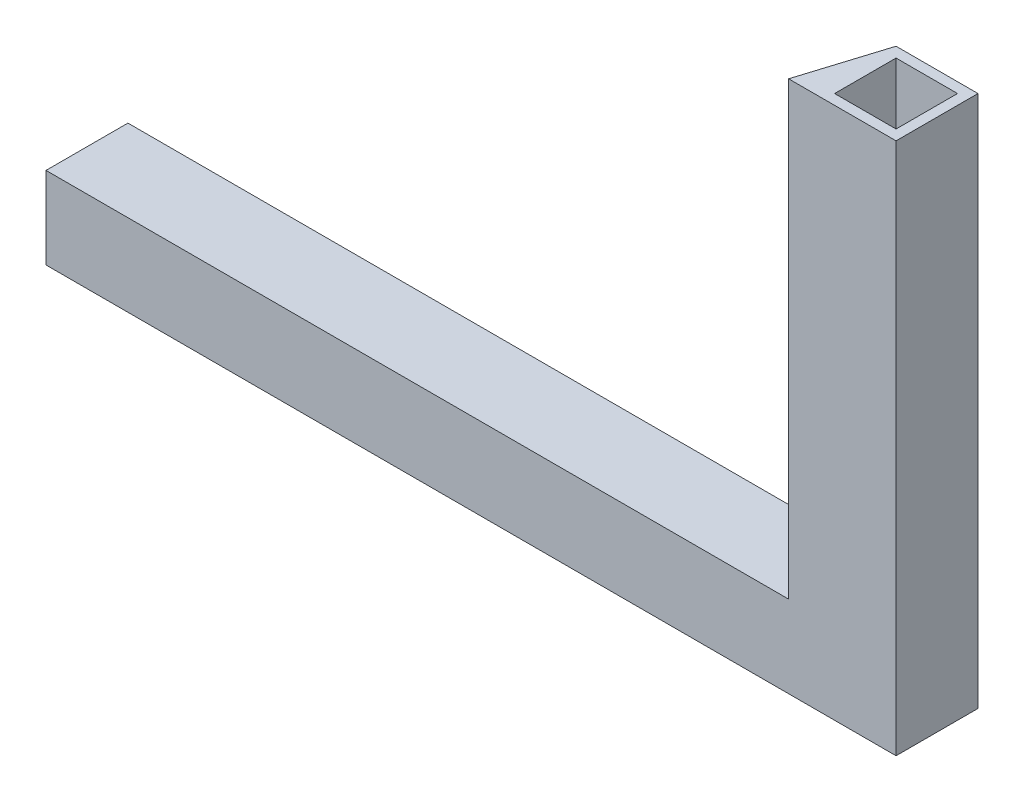
ISO-10303-21;
HEADER;
FILE_DESCRIPTION(('STEP AP214'),'2;1');
FILE_NAME('part.step','',(''),(''),'','','');
FILE_SCHEMA(('AUTOMOTIVE_DESIGN { 1 0 10303 214 1 1 1 1 }'));
ENDSEC;
DATA;
#1=APPLICATION_CONTEXT('core data for automotive mechanical design processes');
#2=APPLICATION_PROTOCOL_DEFINITION('international standard','automotive_design',2000,#1);
#3=PRODUCT_CONTEXT('',#1,'mechanical');
#4=PRODUCT('Part','Part','',(#3));
#5=PRODUCT_RELATED_PRODUCT_CATEGORY('part','',(#4));
#6=PRODUCT_DEFINITION_FORMATION('','',#4);
#7=PRODUCT_DEFINITION_CONTEXT('part definition',#1,'design');
#8=PRODUCT_DEFINITION('design','',#6,#7);
#9=PRODUCT_DEFINITION_SHAPE('','',#8);
#10=(LENGTH_UNIT() NAMED_UNIT(*) SI_UNIT(.MILLI.,.METRE.));
#11=(NAMED_UNIT(*) PLANE_ANGLE_UNIT() SI_UNIT($,.RADIAN.));
#12=(NAMED_UNIT(*) SI_UNIT($,.STERADIAN.) SOLID_ANGLE_UNIT());
#13=UNCERTAINTY_MEASURE_WITH_UNIT(LENGTH_MEASURE(1.E-05),#10,'distance_accuracy_value','');
#14=(GEOMETRIC_REPRESENTATION_CONTEXT(3) GLOBAL_UNCERTAINTY_ASSIGNED_CONTEXT((#13)) GLOBAL_UNIT_ASSIGNED_CONTEXT((#10,
#11,#12)) REPRESENTATION_CONTEXT('',''));
#15=CARTESIAN_POINT('',(0.,0.,0.));
#16=DIRECTION('',(0.,0.,1.));
#17=DIRECTION('',(1.,0.,0.));
#18=AXIS2_PLACEMENT_3D('',#15,#16,#17);
#19=CARTESIAN_POINT('',(0.,20.,-20.));
#20=DIRECTION('',(1.,0.,0.));
#21=DIRECTION('',(0.,0.,-1.));
#22=AXIS2_PLACEMENT_3D('',#19,#20,#21);
#23=PLANE('',#22);
#24=DIRECTION('',(0.,0.,-1.));
#25=VECTOR('',#24,1.);
#26=CARTESIAN_POINT('',(0.,15.,-15.));
#27=LINE('',#26,#25);
#28=CARTESIAN_POINT('',(0.,15.,-4.99999999999996));
#29=VERTEX_POINT('',#28);
#30=CARTESIAN_POINT('',(0.,15.,-15.));
#31=VERTEX_POINT('',#30);
#32=EDGE_CURVE('E190',#29,#31,#27,.T.);
#33=ORIENTED_EDGE('',*,*,#32,.F.);
#34=DIRECTION('',(0.,1.,0.));
#35=VECTOR('',#34,1.);
#36=CARTESIAN_POINT('',(0.,15.,-5.));
#37=LINE('',#36,#35);
#38=CARTESIAN_POINT('',(0.,5.,-5.));
#39=VERTEX_POINT('',#38);
#40=EDGE_CURVE('E56',#39,#29,#37,.T.);
#41=ORIENTED_EDGE('',*,*,#40,.F.);
#42=DIRECTION('',(0.,0.,1.));
#43=VECTOR('',#42,1.);
#44=CARTESIAN_POINT('',(0.,5.,-15.));
#45=LINE('',#44,#43);
#46=CARTESIAN_POINT('',(0.,5.,-15.));
#47=VERTEX_POINT('',#46);
#48=EDGE_CURVE('E179',#47,#39,#45,.T.);
#49=ORIENTED_EDGE('',*,*,#48,.F.);
#50=DIRECTION('',(0.,-1.,0.));
#51=VECTOR('',#50,1.);
#52=CARTESIAN_POINT('',(0.,15.,-15.));
#53=LINE('',#52,#51);
#54=EDGE_CURVE('E193',#31,#47,#53,.T.);
#55=ORIENTED_EDGE('',*,*,#54,.F.);
#56=EDGE_LOOP('',(#33,#41,#49,#55));
#57=FACE_BOUND('',#56,.T.);
#58=DIRECTION('',(0.,0.,1.));
#59=VECTOR('',#58,1.);
#60=CARTESIAN_POINT('',(0.,0.,-20.));
#61=LINE('',#60,#59);
#62=CARTESIAN_POINT('',(0.,0.,-20.));
#63=VERTEX_POINT('',#62);
#64=CARTESIAN_POINT('',(0.,0.,0.));
#65=VERTEX_POINT('',#64);
#66=EDGE_CURVE('E224',#63,#65,#61,.T.);
#67=ORIENTED_EDGE('',*,*,#66,.T.);
#68=DIRECTION('',(0.,-1.,0.));
#69=VECTOR('',#68,1.);
#70=CARTESIAN_POINT('',(0.,20.,0.));
#71=LINE('',#70,#69);
#72=CARTESIAN_POINT('',(0.,20.,0.));
#73=VERTEX_POINT('',#72);
#74=EDGE_CURVE('E11',#73,#65,#71,.T.);
#75=ORIENTED_EDGE('',*,*,#74,.F.);
#76=DIRECTION('',(0.,0.,1.));
#77=VECTOR('',#76,1.);
#78=CARTESIAN_POINT('',(0.,20.,-20.));
#79=LINE('',#78,#77);
#80=CARTESIAN_POINT('',(0.,20.,-20.));
#81=VERTEX_POINT('',#80);
#82=EDGE_CURVE('E225',#81,#73,#79,.T.);
#83=ORIENTED_EDGE('',*,*,#82,.F.);
#84=DIRECTION('',(0.,-1.,0.));
#85=VECTOR('',#84,1.);
#86=CARTESIAN_POINT('',(0.,20.,-20.));
#87=LINE('',#86,#85);
#88=EDGE_CURVE('E233',#81,#63,#87,.T.);
#89=ORIENTED_EDGE('',*,*,#88,.T.);
#90=EDGE_LOOP('',(#67,#75,#83,#89));
#91=FACE_BOUND('',#90,.T.);
#92=ADVANCED_FACE('F33',(#57,#91),#23,.F.);
#93=CARTESIAN_POINT('',(0.,20.,0.));
#94=DIRECTION('',(0.,0.,-1.));
#95=DIRECTION('',(-1.,0.,0.));
#96=AXIS2_PLACEMENT_3D('',#93,#94,#95);
#97=PLANE('',#96);
#98=DIRECTION('',(1.,0.,0.));
#99=VECTOR('',#98,1.);
#100=CARTESIAN_POINT('',(0.,0.,0.));
#101=LINE('',#100,#99);
#102=CARTESIAN_POINT('',(207.5,0.,0.));
#103=VERTEX_POINT('',#102);
#104=EDGE_CURVE('E236',#65,#103,#101,.T.);
#105=ORIENTED_EDGE('',*,*,#104,.T.);
#106=DIRECTION('',(0.,-1.,0.));
#107=VECTOR('',#106,1.);
#108=CARTESIAN_POINT('',(207.5,20.,0.));
#109=LINE('',#108,#107);
#110=CARTESIAN_POINT('',(207.5,130.,0.));
#111=VERTEX_POINT('',#110);
#112=EDGE_CURVE('E41',#111,#103,#109,.T.);
#113=ORIENTED_EDGE('',*,*,#112,.F.);
#114=DIRECTION('',(1.,0.,0.));
#115=VECTOR('',#114,1.);
#116=CARTESIAN_POINT('',(181.270693680917,130.,0.));
#117=LINE('',#116,#115);
#118=CARTESIAN_POINT('',(181.270693680917,130.,0.));
#119=VERTEX_POINT('',#118);
#120=EDGE_CURVE('E213',#119,#111,#117,.T.);
#121=ORIENTED_EDGE('',*,*,#120,.F.);
#122=DIRECTION('',(0.,-1.,0.));
#123=VECTOR('',#122,1.);
#124=CARTESIAN_POINT('',(181.270693680917,130.,0.));
#125=LINE('',#124,#123);
#126=CARTESIAN_POINT('',(181.270693680917,20.,0.));
#127=VERTEX_POINT('',#126);
#128=EDGE_CURVE('E216',#119,#127,#125,.T.);
#129=ORIENTED_EDGE('',*,*,#128,.T.);
#130=DIRECTION('',(1.,0.,0.));
#131=VECTOR('',#130,1.);
#132=CARTESIAN_POINT('',(0.,20.,0.));
#133=LINE('',#132,#131);
#134=EDGE_CURVE('E228',#73,#127,#133,.T.);
#135=ORIENTED_EDGE('',*,*,#134,.F.);
#136=ORIENTED_EDGE('',*,*,#74,.T.);
#137=EDGE_LOOP('',(#105,#113,#121,#129,#135,#136));
#138=FACE_BOUND('',#137,.T.);
#139=ADVANCED_FACE('F274',(#138),#97,.F.);
#140=CARTESIAN_POINT('',(207.5,20.,0.));
#141=DIRECTION('',(-1.,0.,0.));
#142=DIRECTION('',(0.,0.,1.));
#143=AXIS2_PLACEMENT_3D('',#140,#141,#142);
#144=PLANE('',#143);
#145=DIRECTION('',(0.,0.,-1.));
#146=VECTOR('',#145,1.);
#147=CARTESIAN_POINT('',(207.5,0.,0.));
#148=LINE('',#147,#146);
#149=CARTESIAN_POINT('',(207.5,0.,-20.));
#150=VERTEX_POINT('',#149);
#151=EDGE_CURVE('E238',#103,#150,#148,.T.);
#152=ORIENTED_EDGE('',*,*,#151,.T.);
#153=DIRECTION('',(0.,-1.,0.));
#154=VECTOR('',#153,1.);
#155=CARTESIAN_POINT('',(207.5,20.,-20.));
#156=LINE('',#155,#154);
#157=CARTESIAN_POINT('',(207.5,130.,-20.));
#158=VERTEX_POINT('',#157);
#159=EDGE_CURVE('E243',#158,#150,#156,.T.);
#160=ORIENTED_EDGE('',*,*,#159,.F.);
#161=DIRECTION('',(0.,0.,-1.));
#162=VECTOR('',#161,1.);
#163=CARTESIAN_POINT('',(207.5,130.,0.));
#164=LINE('',#163,#162);
#165=EDGE_CURVE('E206',#111,#158,#164,.T.);
#166=ORIENTED_EDGE('',*,*,#165,.F.);
#167=ORIENTED_EDGE('',*,*,#112,.T.);
#168=EDGE_LOOP('',(#152,#160,#166,#167));
#169=FACE_BOUND('',#168,.T.);
#170=ADVANCED_FACE('F250',(#169),#144,.F.);
#171=CARTESIAN_POINT('',(207.5,20.,-20.));
#172=DIRECTION('',(0.,0.,1.));
#173=DIRECTION('',(1.,0.,0.));
#174=AXIS2_PLACEMENT_3D('',#171,#172,#173);
#175=PLANE('',#174);
#176=CARTESIAN_POINT('',(197.5,80.,-20.));
#177=DIRECTION('',(0.,0.,-1.));
#178=DIRECTION('',(-1.,0.,0.));
#179=AXIS2_PLACEMENT_3D('',#176,#177,#178);
#180=CIRCLE('',#179,1.59999999999999);
#181=CARTESIAN_POINT('',(195.9,80.,-20.));
#182=VERTEX_POINT('',#181);
#183=EDGE_CURVE('E172',#182,#182,#180,.T.);
#184=ORIENTED_EDGE('',*,*,#183,.F.);
#185=EDGE_LOOP('',(#184));
#186=FACE_BOUND('',#185,.T.);
#187=DIRECTION('',(-1.,0.,0.));
#188=VECTOR('',#187,1.);
#189=CARTESIAN_POINT('',(207.5,0.,-20.));
#190=LINE('',#189,#188);
#191=EDGE_CURVE('E229',#150,#63,#190,.T.);
#192=ORIENTED_EDGE('',*,*,#191,.T.);
#193=ORIENTED_EDGE('',*,*,#88,.F.);
#194=DIRECTION('',(-1.,0.,0.));
#195=VECTOR('',#194,1.);
#196=CARTESIAN_POINT('',(207.5,20.,-20.));
#197=LINE('',#196,#195);
#198=CARTESIAN_POINT('',(187.5,20.,-20.));
#199=VERTEX_POINT('',#198);
#200=EDGE_CURVE('E231',#199,#81,#197,.T.);
#201=ORIENTED_EDGE('',*,*,#200,.F.);
#202=DIRECTION('',(0.,-1.,0.));
#203=VECTOR('',#202,1.);
#204=CARTESIAN_POINT('',(187.5,130.,-20.));
#205=LINE('',#204,#203);
#206=CARTESIAN_POINT('',(187.5,130.,-20.));
#207=VERTEX_POINT('',#206);
#208=EDGE_CURVE('E221',#207,#199,#205,.T.);
#209=ORIENTED_EDGE('',*,*,#208,.F.);
#210=DIRECTION('',(-1.,0.,0.));
#211=VECTOR('',#210,1.);
#212=CARTESIAN_POINT('',(207.5,130.,-20.));
#213=LINE('',#212,#211);
#214=EDGE_CURVE('E209',#158,#207,#213,.T.);
#215=ORIENTED_EDGE('',*,*,#214,.F.);
#216=ORIENTED_EDGE('',*,*,#159,.T.);
#217=EDGE_LOOP('',(#192,#193,#201,#209,#215,#216));
#218=FACE_BOUND('',#217,.T.);
#219=ADVANCED_FACE('F259',(#186,#218),#175,.F.);
#220=CARTESIAN_POINT('',(0.,20.,0.));
#221=DIRECTION('',(0.,1.,0.));
#222=DIRECTION('',(0.,0.,1.));
#223=AXIS2_PLACEMENT_3D('',#220,#221,#222);
#224=PLANE('',#223);
#225=DIRECTION('',(-0.297374874077784,0.,0.954760799502798));
#226=VECTOR('',#225,1.);
#227=CARTESIAN_POINT('',(187.5,20.,-20.));
#228=LINE('',#227,#226);
#229=EDGE_CURVE('E200',#199,#127,#228,.T.);
#230=ORIENTED_EDGE('',*,*,#229,.F.);
#231=ORIENTED_EDGE('',*,*,#200,.T.);
#232=ORIENTED_EDGE('',*,*,#82,.T.);
#233=ORIENTED_EDGE('',*,*,#134,.T.);
#234=EDGE_LOOP('',(#230,#231,#232,#233));
#235=FACE_BOUND('',#234,.T.);
#236=ADVANCED_FACE('F266',(#235),#224,.T.);
#237=CARTESIAN_POINT('',(0.,0.,0.));
#238=DIRECTION('',(0.,1.,0.));
#239=DIRECTION('',(0.,0.,1.));
#240=AXIS2_PLACEMENT_3D('',#237,#238,#239);
#241=PLANE('',#240);
#242=ORIENTED_EDGE('',*,*,#66,.F.);
#243=ORIENTED_EDGE('',*,*,#191,.F.);
#244=ORIENTED_EDGE('',*,*,#151,.F.);
#245=ORIENTED_EDGE('',*,*,#104,.F.);
#246=EDGE_LOOP('',(#242,#243,#244,#245));
#247=FACE_BOUND('',#246,.T.);
#248=ADVANCED_FACE('F256',(#247),#241,.F.);
#249=CARTESIAN_POINT('',(187.5,130.,-20.));
#250=DIRECTION('',(0.954760799502798,0.,0.297374874077784));
#251=DIRECTION('',(0.297374874077784,0.,-0.954760799502798));
#252=AXIS2_PLACEMENT_3D('',#249,#250,#251);
#253=PLANE('',#252);
#254=ORIENTED_EDGE('',*,*,#229,.T.);
#255=ORIENTED_EDGE('',*,*,#128,.F.);
#256=DIRECTION('',(-0.297374874077784,0.,0.954760799502798));
#257=VECTOR('',#256,1.);
#258=CARTESIAN_POINT('',(187.5,130.,-20.));
#259=LINE('',#258,#257);
#260=EDGE_CURVE('E211',#207,#119,#259,.T.);
#261=ORIENTED_EDGE('',*,*,#260,.F.);
#262=ORIENTED_EDGE('',*,*,#208,.T.);
#263=EDGE_LOOP('',(#254,#255,#261,#262));
#264=FACE_BOUND('',#263,.T.);
#265=ADVANCED_FACE('F270',(#264),#253,.F.);
#266=CARTESIAN_POINT('',(0.,130.,0.));
#267=DIRECTION('',(0.,1.,0.));
#268=DIRECTION('',(0.,0.,1.));
#269=AXIS2_PLACEMENT_3D('',#266,#267,#268);
#270=PLANE('',#269);
#271=DIRECTION('',(0.,0.,1.));
#272=VECTOR('',#271,1.);
#273=CARTESIAN_POINT('',(190.,130.,-2.5));
#274=LINE('',#273,#272);
#275=CARTESIAN_POINT('',(190.,130.,-17.5));
#276=VERTEX_POINT('',#275);
#277=CARTESIAN_POINT('',(190.,130.,-2.5));
#278=VERTEX_POINT('',#277);
#279=EDGE_CURVE('E48',#276,#278,#274,.T.);
#280=ORIENTED_EDGE('',*,*,#279,.F.);
#281=DIRECTION('',(-1.,0.,0.));
#282=VECTOR('',#281,1.);
#283=CARTESIAN_POINT('',(205.,130.,-17.5));
#284=LINE('',#283,#282);
#285=CARTESIAN_POINT('',(205.,130.,-17.5));
#286=VERTEX_POINT('',#285);
#287=EDGE_CURVE('E154',#286,#276,#284,.T.);
#288=ORIENTED_EDGE('',*,*,#287,.F.);
#289=DIRECTION('',(0.,0.,-1.));
#290=VECTOR('',#289,1.);
#291=CARTESIAN_POINT('',(205.,130.,-2.5));
#292=LINE('',#291,#290);
#293=CARTESIAN_POINT('',(205.,130.,-2.5));
#294=VERTEX_POINT('',#293);
#295=EDGE_CURVE('E157',#294,#286,#292,.T.);
#296=ORIENTED_EDGE('',*,*,#295,.F.);
#297=DIRECTION('',(1.,0.,0.));
#298=VECTOR('',#297,1.);
#299=CARTESIAN_POINT('',(205.,130.,-2.5));
#300=LINE('',#299,#298);
#301=EDGE_CURVE('E163',#278,#294,#300,.T.);
#302=ORIENTED_EDGE('',*,*,#301,.F.);
#303=EDGE_LOOP('',(#280,#288,#296,#302));
#304=FACE_BOUND('',#303,.T.);
#305=ORIENTED_EDGE('',*,*,#165,.T.);
#306=ORIENTED_EDGE('',*,*,#214,.T.);
#307=ORIENTED_EDGE('',*,*,#260,.T.);
#308=ORIENTED_EDGE('',*,*,#120,.T.);
#309=EDGE_LOOP('',(#305,#306,#307,#308));
#310=FACE_BOUND('',#309,.T.);
#311=ADVANCED_FACE('F273',(#304,#310),#270,.T.);
#312=CARTESIAN_POINT('',(30.,15.,-4.99999999999996));
#313=DIRECTION('',(0.,0.,1.));
#314=DIRECTION('',(1.,0.,0.));
#315=AXIS2_PLACEMENT_3D('',#312,#313,#314);
#316=PLANE('',#315);
#317=ORIENTED_EDGE('',*,*,#40,.T.);
#318=DIRECTION('',(-1.,0.,0.));
#319=VECTOR('',#318,1.);
#320=CARTESIAN_POINT('',(30.,15.,-4.99999999999996));
#321=LINE('',#320,#319);
#322=CARTESIAN_POINT('',(30.,15.,-4.99999999999996));
#323=VERTEX_POINT('',#322);
#324=EDGE_CURVE('E188',#323,#29,#321,.T.);
#325=ORIENTED_EDGE('',*,*,#324,.F.);
#326=DIRECTION('',(0.,1.,0.));
#327=VECTOR('',#326,1.);
#328=CARTESIAN_POINT('',(30.,15.,-4.99999999999996));
#329=LINE('',#328,#327);
#330=CARTESIAN_POINT('',(30.,5.,-4.99999999999996));
#331=VERTEX_POINT('',#330);
#332=EDGE_CURVE('E175',#331,#323,#329,.T.);
#333=ORIENTED_EDGE('',*,*,#332,.F.);
#334=DIRECTION('',(-1.,0.,0.));
#335=VECTOR('',#334,1.);
#336=CARTESIAN_POINT('',(30.,5.,-4.99999999999996));
#337=LINE('',#336,#335);
#338=EDGE_CURVE('E198',#331,#39,#337,.T.);
#339=ORIENTED_EDGE('',*,*,#338,.T.);
#340=EDGE_LOOP('',(#317,#325,#333,#339));
#341=FACE_BOUND('',#340,.T.);
#342=ADVANCED_FACE('F294',(#341),#316,.F.);
#343=CARTESIAN_POINT('',(30.,5.,-15.));
#344=DIRECTION('',(0.,-1.,0.));
#345=DIRECTION('',(0.,0.,-1.));
#346=AXIS2_PLACEMENT_3D('',#343,#344,#345);
#347=PLANE('',#346);
#348=ORIENTED_EDGE('',*,*,#48,.T.);
#349=ORIENTED_EDGE('',*,*,#338,.F.);
#350=DIRECTION('',(0.,0.,1.));
#351=VECTOR('',#350,1.);
#352=CARTESIAN_POINT('',(30.,5.,-15.));
#353=LINE('',#352,#351);
#354=CARTESIAN_POINT('',(30.,5.,-15.));
#355=VERTEX_POINT('',#354);
#356=EDGE_CURVE('E185',#355,#331,#353,.T.);
#357=ORIENTED_EDGE('',*,*,#356,.F.);
#358=DIRECTION('',(-1.,0.,0.));
#359=VECTOR('',#358,1.);
#360=CARTESIAN_POINT('',(30.,5.,-15.));
#361=LINE('',#360,#359);
#362=EDGE_CURVE('E201',#355,#47,#361,.T.);
#363=ORIENTED_EDGE('',*,*,#362,.T.);
#364=EDGE_LOOP('',(#348,#349,#357,#363));
#365=FACE_BOUND('',#364,.T.);
#366=ADVANCED_FACE('F298',(#365),#347,.F.);
#367=CARTESIAN_POINT('',(30.,15.,-15.));
#368=DIRECTION('',(0.,0.,-1.));
#369=DIRECTION('',(-1.,0.,0.));
#370=AXIS2_PLACEMENT_3D('',#367,#368,#369);
#371=PLANE('',#370);
#372=ORIENTED_EDGE('',*,*,#54,.T.);
#373=ORIENTED_EDGE('',*,*,#362,.F.);
#374=DIRECTION('',(0.,-1.,0.));
#375=VECTOR('',#374,1.);
#376=CARTESIAN_POINT('',(30.,15.,-15.));
#377=LINE('',#376,#375);
#378=CARTESIAN_POINT('',(30.,15.,-15.));
#379=VERTEX_POINT('',#378);
#380=EDGE_CURVE('E182',#379,#355,#377,.T.);
#381=ORIENTED_EDGE('',*,*,#380,.F.);
#382=DIRECTION('',(-1.,0.,0.));
#383=VECTOR('',#382,1.);
#384=CARTESIAN_POINT('',(30.,15.,-15.));
#385=LINE('',#384,#383);
#386=EDGE_CURVE('E203',#379,#31,#385,.T.);
#387=ORIENTED_EDGE('',*,*,#386,.T.);
#388=EDGE_LOOP('',(#372,#373,#381,#387));
#389=FACE_BOUND('',#388,.T.);
#390=ADVANCED_FACE('F303',(#389),#371,.F.);
#391=CARTESIAN_POINT('',(30.,15.,-15.));
#392=DIRECTION('',(0.,1.,0.));
#393=DIRECTION('',(0.,0.,1.));
#394=AXIS2_PLACEMENT_3D('',#391,#392,#393);
#395=PLANE('',#394);
#396=ORIENTED_EDGE('',*,*,#32,.T.);
#397=ORIENTED_EDGE('',*,*,#386,.F.);
#398=DIRECTION('',(0.,0.,-1.));
#399=VECTOR('',#398,1.);
#400=CARTESIAN_POINT('',(30.,15.,-15.));
#401=LINE('',#400,#399);
#402=EDGE_CURVE('E178',#323,#379,#401,.T.);
#403=ORIENTED_EDGE('',*,*,#402,.F.);
#404=ORIENTED_EDGE('',*,*,#324,.T.);
#405=EDGE_LOOP('',(#396,#397,#403,#404));
#406=FACE_BOUND('',#405,.T.);
#407=ADVANCED_FACE('F299',(#406),#395,.F.);
#408=CARTESIAN_POINT('',(30.,0.,0.));
#409=DIRECTION('',(-1.,0.,0.));
#410=DIRECTION('',(0.,0.,1.));
#411=AXIS2_PLACEMENT_3D('',#408,#409,#410);
#412=PLANE('',#411);
#413=ORIENTED_EDGE('',*,*,#332,.T.);
#414=ORIENTED_EDGE('',*,*,#402,.T.);
#415=ORIENTED_EDGE('',*,*,#380,.T.);
#416=ORIENTED_EDGE('',*,*,#356,.T.);
#417=EDGE_LOOP('',(#413,#414,#415,#416));
#418=FACE_BOUND('',#417,.T.);
#419=ADVANCED_FACE('F302',(#418),#412,.T.);
#420=CARTESIAN_POINT('',(197.5,80.,-20.));
#421=DIRECTION('',(0.,0.,-1.));
#422=DIRECTION('',(-1.,0.,0.));
#423=AXIS2_PLACEMENT_3D('',#420,#421,#422);
#424=CYLINDRICAL_SURFACE('',#423,1.59999999999999);
#425=CARTESIAN_POINT('',(197.5,80.,-17.5));
#426=DIRECTION('',(0.,0.,-1.));
#427=DIRECTION('',(-1.,0.,0.));
#428=AXIS2_PLACEMENT_3D('',#425,#426,#427);
#429=CIRCLE('',#428,1.59999999999999);
#430=CARTESIAN_POINT('',(195.9,80.,-17.5));
#431=VERTEX_POINT('',#430);
#432=EDGE_CURVE('E36',#431,#431,#429,.F.);
#433=ORIENTED_EDGE('',*,*,#432,.T.);
#434=EDGE_LOOP('',(#433));
#435=FACE_BOUND('',#434,.T.);
#436=ORIENTED_EDGE('',*,*,#183,.T.);
#437=EDGE_LOOP('',(#436));
#438=FACE_BOUND('',#437,.T.);
#439=ADVANCED_FACE('F313',(#435,#438),#424,.F.);
#440=CARTESIAN_POINT('',(205.,70.,-17.5));
#441=DIRECTION('',(0.,0.,-1.));
#442=DIRECTION('',(-1.,0.,0.));
#443=AXIS2_PLACEMENT_3D('',#440,#441,#442);
#444=PLANE('',#443);
#445=ORIENTED_EDGE('',*,*,#287,.T.);
#446=DIRECTION('',(0.,1.,0.));
#447=VECTOR('',#446,1.);
#448=CARTESIAN_POINT('',(190.,70.,-17.5));
#449=LINE('',#448,#447);
#450=CARTESIAN_POINT('',(190.,70.,-17.5));
#451=VERTEX_POINT('',#450);
#452=EDGE_CURVE('E167',#451,#276,#449,.T.);
#453=ORIENTED_EDGE('',*,*,#452,.F.);
#454=DIRECTION('',(-1.,0.,0.));
#455=VECTOR('',#454,1.);
#456=CARTESIAN_POINT('',(205.,70.,-17.5));
#457=LINE('',#456,#455);
#458=CARTESIAN_POINT('',(205.,70.,-17.5));
#459=VERTEX_POINT('',#458);
#460=EDGE_CURVE('E142',#459,#451,#457,.T.);
#461=ORIENTED_EDGE('',*,*,#460,.F.);
#462=DIRECTION('',(0.,1.,0.));
#463=VECTOR('',#462,1.);
#464=CARTESIAN_POINT('',(205.,70.,-17.5));
#465=LINE('',#464,#463);
#466=EDGE_CURVE('E169',#459,#286,#465,.T.);
#467=ORIENTED_EDGE('',*,*,#466,.T.);
#468=EDGE_LOOP('',(#445,#453,#461,#467));
#469=FACE_BOUND('',#468,.T.);
#470=ORIENTED_EDGE('',*,*,#432,.F.);
#471=EDGE_LOOP('',(#470));
#472=FACE_BOUND('',#471,.T.);
#473=ADVANCED_FACE('F317',(#469,#472),#444,.F.);
#474=CARTESIAN_POINT('',(190.,70.,-2.5));
#475=DIRECTION('',(-1.,0.,0.));
#476=DIRECTION('',(0.,0.,1.));
#477=AXIS2_PLACEMENT_3D('',#474,#475,#476);
#478=PLANE('',#477);
#479=ORIENTED_EDGE('',*,*,#279,.T.);
#480=DIRECTION('',(0.,1.,0.));
#481=VECTOR('',#480,1.);
#482=CARTESIAN_POINT('',(190.,70.,-2.5));
#483=LINE('',#482,#481);
#484=CARTESIAN_POINT('',(190.,70.,-2.5));
#485=VERTEX_POINT('',#484);
#486=EDGE_CURVE('E132',#485,#278,#483,.T.);
#487=ORIENTED_EDGE('',*,*,#486,.F.);
#488=DIRECTION('',(0.,0.,1.));
#489=VECTOR('',#488,1.);
#490=CARTESIAN_POINT('',(190.,70.,-2.5));
#491=LINE('',#490,#489);
#492=EDGE_CURVE('E136',#451,#485,#491,.T.);
#493=ORIENTED_EDGE('',*,*,#492,.F.);
#494=ORIENTED_EDGE('',*,*,#452,.T.);
#495=EDGE_LOOP('',(#479,#487,#493,#494));
#496=FACE_BOUND('',#495,.T.);
#497=ADVANCED_FACE('F134',(#496),#478,.F.);
#498=CARTESIAN_POINT('',(205.,70.,-2.5));
#499=DIRECTION('',(1.,0.,0.));
#500=DIRECTION('',(0.,0.,-1.));
#501=AXIS2_PLACEMENT_3D('',#498,#499,#500);
#502=PLANE('',#501);
#503=ORIENTED_EDGE('',*,*,#295,.T.);
#504=ORIENTED_EDGE('',*,*,#466,.F.);
#505=DIRECTION('',(0.,0.,-1.));
#506=VECTOR('',#505,1.);
#507=CARTESIAN_POINT('',(205.,70.,-2.5));
#508=LINE('',#507,#506);
#509=CARTESIAN_POINT('',(205.,70.,-2.5));
#510=VERTEX_POINT('',#509);
#511=EDGE_CURVE('E150',#510,#459,#508,.T.);
#512=ORIENTED_EDGE('',*,*,#511,.F.);
#513=DIRECTION('',(0.,1.,0.));
#514=VECTOR('',#513,1.);
#515=CARTESIAN_POINT('',(205.,70.,-2.5));
#516=LINE('',#515,#514);
#517=EDGE_CURVE('E141',#510,#294,#516,.T.);
#518=ORIENTED_EDGE('',*,*,#517,.T.);
#519=EDGE_LOOP('',(#503,#504,#512,#518));
#520=FACE_BOUND('',#519,.T.);
#521=ADVANCED_FACE('F321',(#520),#502,.F.);
#522=CARTESIAN_POINT('',(205.,70.,-2.5));
#523=DIRECTION('',(0.,0.,1.));
#524=DIRECTION('',(1.,0.,0.));
#525=AXIS2_PLACEMENT_3D('',#522,#523,#524);
#526=PLANE('',#525);
#527=ORIENTED_EDGE('',*,*,#301,.T.);
#528=ORIENTED_EDGE('',*,*,#517,.F.);
#529=DIRECTION('',(1.,0.,0.));
#530=VECTOR('',#529,1.);
#531=CARTESIAN_POINT('',(205.,70.,-2.5));
#532=LINE('',#531,#530);
#533=EDGE_CURVE('E145',#485,#510,#532,.T.);
#534=ORIENTED_EDGE('',*,*,#533,.F.);
#535=ORIENTED_EDGE('',*,*,#486,.T.);
#536=EDGE_LOOP('',(#527,#528,#534,#535));
#537=FACE_BOUND('',#536,.T.);
#538=ADVANCED_FACE('F146',(#537),#526,.F.);
#539=CARTESIAN_POINT('',(0.,70.,0.));
#540=DIRECTION('',(0.,1.,0.));
#541=DIRECTION('',(0.,0.,1.));
#542=AXIS2_PLACEMENT_3D('',#539,#540,#541);
#543=PLANE('',#542);
#544=ORIENTED_EDGE('',*,*,#492,.T.);
#545=ORIENTED_EDGE('',*,*,#533,.T.);
#546=ORIENTED_EDGE('',*,*,#511,.T.);
#547=ORIENTED_EDGE('',*,*,#460,.T.);
#548=EDGE_LOOP('',(#544,#545,#546,#547));
#549=FACE_BOUND('',#548,.T.);
#550=ADVANCED_FACE('F152',(#549),#543,.T.);
#551=CLOSED_SHELL('',(#92,#139,#170,#219,#236,#248,#265,#311,#342,#366,#390,#407,#419,#439,#473,
#497,#521,#538,#550));
#552=MANIFOLD_SOLID_BREP('B2',#551);
#553=ADVANCED_BREP_SHAPE_REPRESENTATION('',(#18,#552),#14);
#554=SHAPE_DEFINITION_REPRESENTATION(#9,#553);
ENDSEC;
END-ISO-10303-21;
